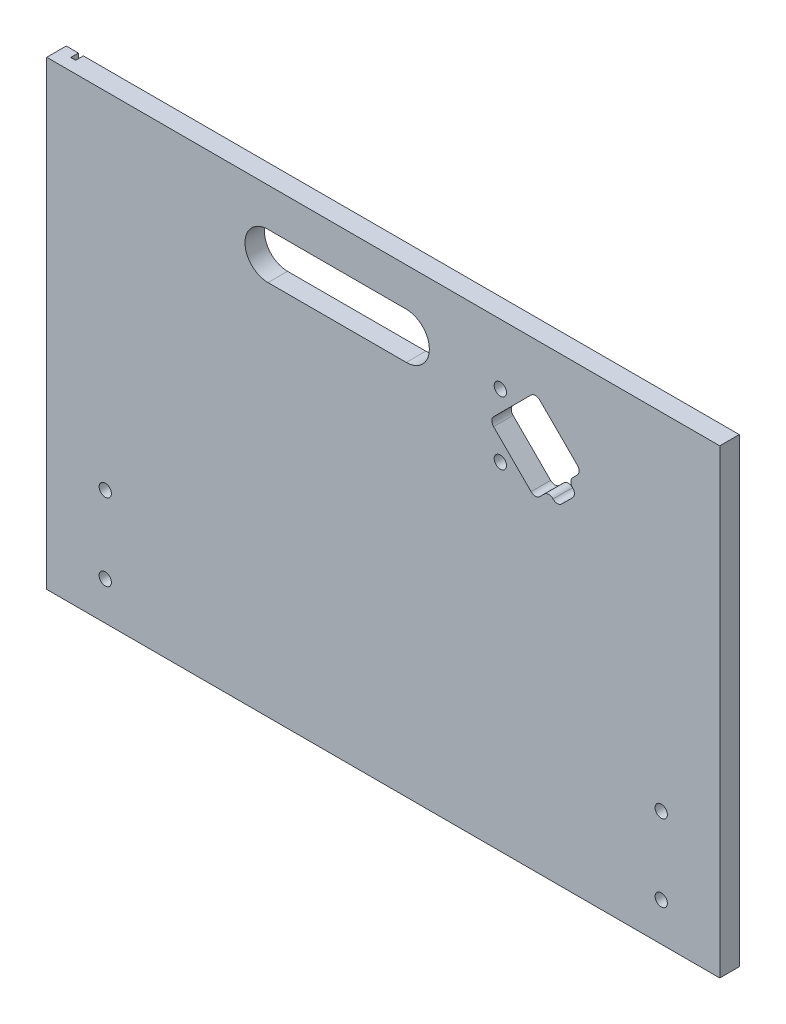
ISO-10303-21;
HEADER;
FILE_DESCRIPTION(('STEP AP214'),'2;1');
FILE_NAME('part.step','',(''),(''),'','','');
FILE_SCHEMA(('AUTOMOTIVE_DESIGN { 1 0 10303 214 1 1 1 1 }'));
ENDSEC;
DATA;
#1=APPLICATION_CONTEXT('core data for automotive mechanical design processes');
#2=APPLICATION_PROTOCOL_DEFINITION('international standard','automotive_design',2000,#1);
#3=PRODUCT_CONTEXT('',#1,'mechanical');
#4=PRODUCT('Part','Part','',(#3));
#5=PRODUCT_RELATED_PRODUCT_CATEGORY('part','',(#4));
#6=PRODUCT_DEFINITION_FORMATION('','',#4);
#7=PRODUCT_DEFINITION_CONTEXT('part definition',#1,'design');
#8=PRODUCT_DEFINITION('design','',#6,#7);
#9=PRODUCT_DEFINITION_SHAPE('','',#8);
#10=(LENGTH_UNIT() NAMED_UNIT(*) SI_UNIT(.MILLI.,.METRE.));
#11=(NAMED_UNIT(*) PLANE_ANGLE_UNIT() SI_UNIT($,.RADIAN.));
#12=(NAMED_UNIT(*) SI_UNIT($,.STERADIAN.) SOLID_ANGLE_UNIT());
#13=UNCERTAINTY_MEASURE_WITH_UNIT(LENGTH_MEASURE(1.E-05),#10,'distance_accuracy_value','');
#14=(GEOMETRIC_REPRESENTATION_CONTEXT(3) GLOBAL_UNCERTAINTY_ASSIGNED_CONTEXT((#13)) GLOBAL_UNIT_ASSIGNED_CONTEXT((#10,
#11,#12)) REPRESENTATION_CONTEXT('',''));
#15=CARTESIAN_POINT('',(0.,0.,0.));
#16=DIRECTION('',(0.,0.,1.));
#17=DIRECTION('',(1.,0.,0.));
#18=AXIS2_PLACEMENT_3D('',#15,#16,#17);
#19=CARTESIAN_POINT('',(0.,0.,12.7));
#20=DIRECTION('',(0.,0.,1.));
#21=DIRECTION('',(1.,0.,0.));
#22=AXIS2_PLACEMENT_3D('',#19,#20,#21);
#23=PLANE('',#22);
#24=CARTESIAN_POINT('',(15.,110.,12.7));
#25=DIRECTION('',(0.,0.,1.));
#26=DIRECTION('',(1.,0.,0.));
#27=AXIS2_PLACEMENT_3D('',#24,#25,#26);
#28=CIRCLE('',#27,15.);
#29=CARTESIAN_POINT('',(15.,95.,12.7));
#30=VERTEX_POINT('',#29);
#31=CARTESIAN_POINT('',(15.,125.,12.7));
#32=VERTEX_POINT('',#31);
#33=EDGE_CURVE('E105',#30,#32,#28,.T.);
#34=ORIENTED_EDGE('',*,*,#33,.F.);
#35=DIRECTION('',(1.,0.,0.));
#36=VECTOR('',#35,1.);
#37=CARTESIAN_POINT('',(15.,95.,12.7));
#38=LINE('',#37,#36);
#39=CARTESIAN_POINT('',(-75.,95.,12.7));
#40=VERTEX_POINT('',#39);
#41=EDGE_CURVE('E270',#40,#30,#38,.T.);
#42=ORIENTED_EDGE('',*,*,#41,.F.);
#43=CARTESIAN_POINT('',(-75.,110.,12.7));
#44=DIRECTION('',(0.,0.,1.));
#45=DIRECTION('',(1.,0.,0.));
#46=AXIS2_PLACEMENT_3D('',#43,#44,#45);
#47=CIRCLE('',#46,15.);
#48=CARTESIAN_POINT('',(-75.,125.,12.7));
#49=VERTEX_POINT('',#48);
#50=EDGE_CURVE('E290',#49,#40,#47,.T.);
#51=ORIENTED_EDGE('',*,*,#50,.F.);
#52=DIRECTION('',(-1.,0.,0.));
#53=VECTOR('',#52,1.);
#54=CARTESIAN_POINT('',(15.,125.,12.7));
#55=LINE('',#54,#53);
#56=EDGE_CURVE('E284',#32,#49,#55,.T.);
#57=ORIENTED_EDGE('',*,*,#56,.F.);
#58=EDGE_LOOP('',(#34,#42,#51,#57));
#59=FACE_BOUND('',#58,.T.);
#60=CARTESIAN_POINT('',(-180.95,-75.,12.7));
#61=DIRECTION('',(0.,0.,1.));
#62=DIRECTION('',(1.,0.,0.));
#63=AXIS2_PLACEMENT_3D('',#60,#61,#62);
#64=CIRCLE('',#63,3.99999999999999);
#65=CARTESIAN_POINT('',(-176.95,-75.,12.7));
#66=VERTEX_POINT('',#65);
#67=EDGE_CURVE('E276',#66,#66,#64,.F.);
#68=ORIENTED_EDGE('',*,*,#67,.T.);
#69=EDGE_LOOP('',(#68));
#70=FACE_BOUND('',#69,.T.);
#71=CARTESIAN_POINT('',(-180.95,-125.,12.7));
#72=DIRECTION('',(0.,0.,1.));
#73=DIRECTION('',(1.,0.,0.));
#74=AXIS2_PLACEMENT_3D('',#71,#72,#73);
#75=CIRCLE('',#74,4.);
#76=CARTESIAN_POINT('',(-176.95,-125.,12.7));
#77=VERTEX_POINT('',#76);
#78=EDGE_CURVE('E302',#77,#77,#75,.F.);
#79=ORIENTED_EDGE('',*,*,#78,.T.);
#80=EDGE_LOOP('',(#79));
#81=FACE_BOUND('',#80,.T.);
#82=CARTESIAN_POINT('',(180.95,-125.,12.7));
#83=DIRECTION('',(0.,0.,1.));
#84=DIRECTION('',(1.,0.,0.));
#85=AXIS2_PLACEMENT_3D('',#82,#83,#84);
#86=CIRCLE('',#85,4.);
#87=CARTESIAN_POINT('',(184.95,-125.,12.7));
#88=VERTEX_POINT('',#87);
#89=EDGE_CURVE('E308',#88,#88,#86,.F.);
#90=ORIENTED_EDGE('',*,*,#89,.T.);
#91=EDGE_LOOP('',(#90));
#92=FACE_BOUND('',#91,.T.);
#93=CARTESIAN_POINT('',(180.95,-75.,12.7));
#94=DIRECTION('',(0.,0.,1.));
#95=DIRECTION('',(1.,0.,0.));
#96=AXIS2_PLACEMENT_3D('',#93,#94,#95);
#97=CIRCLE('',#96,3.99999999999999);
#98=CARTESIAN_POINT('',(184.95,-75.,12.7));
#99=VERTEX_POINT('',#98);
#100=EDGE_CURVE('E314',#99,#99,#97,.F.);
#101=ORIENTED_EDGE('',*,*,#100,.T.);
#102=EDGE_LOOP('',(#101));
#103=FACE_BOUND('',#102,.T.);
#104=DIRECTION('',(0.,-1.,0.));
#105=VECTOR('',#104,1.);
#106=CARTESIAN_POINT('',(219.05,0.,12.7));
#107=LINE('',#106,#105);
#108=CARTESIAN_POINT('',(219.05,150.,12.7));
#109=VERTEX_POINT('',#108);
#110=CARTESIAN_POINT('',(219.05,-150.,12.7));
#111=VERTEX_POINT('',#110);
#112=EDGE_CURVE('E400',#109,#111,#107,.T.);
#113=ORIENTED_EDGE('',*,*,#112,.F.);
#114=DIRECTION('',(-1.,0.,0.));
#115=VECTOR('',#114,1.);
#116=CARTESIAN_POINT('',(0.,150.,12.7));
#117=LINE('',#116,#115);
#118=CARTESIAN_POINT('',(-219.05,150.,12.7));
#119=VERTEX_POINT('',#118);
#120=EDGE_CURVE('E403',#109,#119,#117,.T.);
#121=ORIENTED_EDGE('',*,*,#120,.T.);
#122=DIRECTION('',(0.,-1.,0.));
#123=VECTOR('',#122,1.);
#124=CARTESIAN_POINT('',(-219.05,0.,12.7));
#125=LINE('',#124,#123);
#126=CARTESIAN_POINT('',(-219.05,-150.,12.7));
#127=VERTEX_POINT('',#126);
#128=EDGE_CURVE('E406',#119,#127,#125,.T.);
#129=ORIENTED_EDGE('',*,*,#128,.T.);
#130=DIRECTION('',(-1.,0.,0.));
#131=VECTOR('',#130,1.);
#132=CARTESIAN_POINT('',(0.,-150.,12.7));
#133=LINE('',#132,#131);
#134=EDGE_CURVE('E408',#111,#127,#133,.T.);
#135=ORIENTED_EDGE('',*,*,#134,.F.);
#136=EDGE_LOOP('',(#113,#121,#129,#135));
#137=FACE_BOUND('',#136,.T.);
#138=DIRECTION('',(-0.707106781186544,-0.707106781186551,0.));
#139=VECTOR('',#138,1.);
#140=CARTESIAN_POINT('',(19.5510191002148,-19.5510191002146,12.7));
#141=LINE('',#140,#139);
#142=CARTESIAN_POINT('',(126.273611075682,87.1715728752538,12.7));
#143=VERTEX_POINT('',#142);
#144=CARTESIAN_POINT('',(123.268407255639,84.1663690552109,12.7));
#145=VERTEX_POINT('',#144);
#146=EDGE_CURVE('E387',#143,#145,#141,.T.);
#147=ORIENTED_EDGE('',*,*,#146,.T.);
#148=CARTESIAN_POINT('',(126.096834380386,81.3379419304648,12.7));
#149=DIRECTION('',(0.,0.,1.));
#150=DIRECTION('',(1.,0.,0.));
#151=AXIS2_PLACEMENT_3D('',#148,#149,#150);
#152=CIRCLE('',#151,4.);
#153=CARTESIAN_POINT('',(123.268407255639,78.5095148057186,12.7));
#154=VERTEX_POINT('',#153);
#155=EDGE_CURVE('E453',#145,#154,#152,.T.);
#156=ORIENTED_EDGE('',*,*,#155,.T.);
#157=CARTESIAN_POINT('',(120.439980130893,75.6810876809724,12.7));
#158=DIRECTION('',(0.,0.,1.));
#159=DIRECTION('',(1.,0.,0.));
#160=AXIS2_PLACEMENT_3D('',#157,#158,#159);
#161=CIRCLE('',#160,4.);
#162=CARTESIAN_POINT('',(123.268407255639,72.8526605562262,12.7));
#163=VERTEX_POINT('',#162);
#164=EDGE_CURVE('E481',#154,#163,#161,.F.);
#165=ORIENTED_EDGE('',*,*,#164,.T.);
#166=DIRECTION('',(-0.707106781186545,-0.70710678118655,0.));
#167=VECTOR('',#166,1.);
#168=CARTESIAN_POINT('',(25.2078733497071,-25.2078733497069,12.7));
#169=LINE('',#168,#167);
#170=CARTESIAN_POINT('',(116.197339443774,65.7815927443607,12.7));
#171=VERTEX_POINT('',#170);
#172=EDGE_CURVE('E384',#163,#171,#169,.T.);
#173=ORIENTED_EDGE('',*,*,#172,.T.);
#174=CARTESIAN_POINT('',(113.368912319028,68.6100198691068,12.7));
#175=DIRECTION('',(0.,0.,1.));
#176=DIRECTION('',(1.,0.,0.));
#177=AXIS2_PLACEMENT_3D('',#174,#175,#176);
#178=CIRCLE('',#177,4.);
#179=CARTESIAN_POINT('',(110.540485194282,65.7815927443606,12.7));
#180=VERTEX_POINT('',#179);
#181=EDGE_CURVE('E485',#171,#180,#178,.F.);
#182=ORIENTED_EDGE('',*,*,#181,.T.);
#183=CARTESIAN_POINT('',(107.712058069535,62.9531656196144,12.7));
#184=DIRECTION('',(0.,0.,1.));
#185=DIRECTION('',(1.,0.,0.));
#186=AXIS2_PLACEMENT_3D('',#183,#184,#185);
#187=CIRCLE('',#186,4.);
#188=CARTESIAN_POINT('',(104.883630944789,65.7815927443607,12.7));
#189=VERTEX_POINT('',#188);
#190=EDGE_CURVE('E451',#180,#189,#187,.T.);
#191=ORIENTED_EDGE('',*,*,#190,.T.);
#192=DIRECTION('',(0.707106781186545,0.70710678118655,0.));
#193=VECTOR('',#192,1.);
#194=CARTESIAN_POINT('',(19.5510191002147,-19.5510191002145,12.7));
#195=LINE('',#194,#193);
#196=CARTESIAN_POINT('',(101.878427124746,62.7763889243178,12.7));
#197=VERTEX_POINT('',#196);
#198=EDGE_CURVE('E381',#197,#189,#195,.T.);
#199=ORIENTED_EDGE('',*,*,#198,.F.);
#200=CARTESIAN_POINT('',(99.0500000000002,65.604816049064,12.7));
#201=DIRECTION('',(0.,0.,1.));
#202=DIRECTION('',(1.,0.,0.));
#203=AXIS2_PLACEMENT_3D('',#200,#201,#202);
#204=CIRCLE('',#203,4.);
#205=CARTESIAN_POINT('',(96.221572875254,62.7763889243178,12.7));
#206=VERTEX_POINT('',#205);
#207=EDGE_CURVE('E97',#197,#206,#204,.F.);
#208=ORIENTED_EDGE('',*,*,#207,.T.);
#209=DIRECTION('',(0.70710678118655,-0.707106781186546,0.));
#210=VECTOR('',#209,1.);
#211=CARTESIAN_POINT('',(79.4989808997856,79.4989808997861,12.7));
#212=LINE('',#211,#210);
#213=CARTESIAN_POINT('',(71.8263889243181,87.1715728752536,12.7));
#214=VERTEX_POINT('',#213);
#215=EDGE_CURVE('E378',#214,#206,#212,.T.);
#216=ORIENTED_EDGE('',*,*,#215,.F.);
#217=CARTESIAN_POINT('',(74.6548160490642,89.9999999999998,12.7));
#218=DIRECTION('',(0.,0.,1.));
#219=DIRECTION('',(1.,0.,0.));
#220=AXIS2_PLACEMENT_3D('',#217,#218,#219);
#221=CIRCLE('',#220,4.);
#222=CARTESIAN_POINT('',(71.826388924318,92.828427124746,12.7));
#223=VERTEX_POINT('',#222);
#224=EDGE_CURVE('E477',#214,#223,#221,.F.);
#225=ORIENTED_EDGE('',*,*,#224,.T.);
#226=DIRECTION('',(-0.707106781186545,-0.70710678118655,0.));
#227=VECTOR('',#226,1.);
#228=CARTESIAN_POINT('',(-10.5010191002137,10.5010191002136,12.7));
#229=LINE('',#228,#227);
#230=CARTESIAN_POINT('',(96.2215728752538,117.223611075682,12.7));
#231=VERTEX_POINT('',#230);
#232=EDGE_CURVE('E393',#231,#223,#229,.T.);
#233=ORIENTED_EDGE('',*,*,#232,.F.);
#234=CARTESIAN_POINT('',(99.05,114.395183950936,12.7));
#235=DIRECTION('',(0.,0.,1.));
#236=DIRECTION('',(1.,0.,0.));
#237=AXIS2_PLACEMENT_3D('',#234,#235,#236);
#238=CIRCLE('',#237,4.);
#239=CARTESIAN_POINT('',(101.878427124746,117.223611075682,12.7));
#240=VERTEX_POINT('',#239);
#241=EDGE_CURVE('E473',#231,#240,#238,.F.);
#242=ORIENTED_EDGE('',*,*,#241,.T.);
#243=DIRECTION('',(0.70710678118655,-0.707106781186545,0.));
#244=VECTOR('',#243,1.);
#245=CARTESIAN_POINT('',(109.551019100214,109.551019100215,12.7));
#246=LINE('',#245,#244);
#247=CARTESIAN_POINT('',(126.273611075682,92.8284271247462,12.7));
#248=VERTEX_POINT('',#247);
#249=EDGE_CURVE('E390',#240,#248,#246,.T.);
#250=ORIENTED_EDGE('',*,*,#249,.T.);
#251=CARTESIAN_POINT('',(123.445183950936,90.,12.7));
#252=DIRECTION('',(0.,0.,1.));
#253=DIRECTION('',(1.,0.,0.));
#254=AXIS2_PLACEMENT_3D('',#251,#252,#253);
#255=CIRCLE('',#254,4.);
#256=EDGE_CURVE('E469',#248,#143,#255,.F.);
#257=ORIENTED_EDGE('',*,*,#256,.T.);
#258=EDGE_LOOP('',(#147,#156,#165,#173,#182,#191,#199,#208,#216,#225,#233,#242,#250,#257));
#259=FACE_BOUND('',#258,.T.);
#260=CARTESIAN_POINT('',(76.2148703851,110.5900655849,12.7));
#261=DIRECTION('',(0.,0.,1.));
#262=DIRECTION('',(1.,0.,0.));
#263=AXIS2_PLACEMENT_3D('',#260,#261,#262);
#264=CIRCLE('',#263,4.0000000001913);
#265=CARTESIAN_POINT('',(80.2148703852913,110.5900655849,12.7));
#266=VERTEX_POINT('',#265);
#267=EDGE_CURVE('E353',#266,#266,#264,.T.);
#268=ORIENTED_EDGE('',*,*,#267,.F.);
#269=EDGE_LOOP('',(#268));
#270=FACE_BOUND('',#269,.T.);
#271=CARTESIAN_POINT('',(76.2148703851002,69.4099344154998,12.7));
#272=DIRECTION('',(0.,0.,1.));
#273=DIRECTION('',(1.,0.,0.));
#274=AXIS2_PLACEMENT_3D('',#271,#272,#273);
#275=CIRCLE('',#274,4.00000000019125);
#276=CARTESIAN_POINT('',(80.2148703852914,69.4099344154998,12.7));
#277=VERTEX_POINT('',#276);
#278=EDGE_CURVE('E350',#277,#277,#275,.F.);
#279=ORIENTED_EDGE('',*,*,#278,.T.);
#280=EDGE_LOOP('',(#279));
#281=FACE_BOUND('',#280,.T.);
#282=ADVANCED_FACE('F88',(#59,#70,#81,#92,#103,#137,#259,#270,#281),#23,.T.);
#283=CARTESIAN_POINT('',(0.,0.,0.));
#284=DIRECTION('',(0.,0.,1.));
#285=DIRECTION('',(1.,0.,0.));
#286=AXIS2_PLACEMENT_3D('',#283,#284,#285);
#287=PLANE('',#286);
#288=DIRECTION('',(-1.,0.,0.));
#289=VECTOR('',#288,1.);
#290=CARTESIAN_POINT('',(15.,95.,0.));
#291=LINE('',#290,#289);
#292=CARTESIAN_POINT('',(15.,95.,0.));
#293=VERTEX_POINT('',#292);
#294=CARTESIAN_POINT('',(-75.,95.,0.));
#295=VERTEX_POINT('',#294);
#296=EDGE_CURVE('E282',#293,#295,#291,.T.);
#297=ORIENTED_EDGE('',*,*,#296,.F.);
#298=CARTESIAN_POINT('',(15.,110.,0.));
#299=DIRECTION('',(0.,0.,1.));
#300=DIRECTION('',(1.,0.,0.));
#301=AXIS2_PLACEMENT_3D('',#298,#299,#300);
#302=CIRCLE('',#301,15.);
#303=CARTESIAN_POINT('',(15.,125.,0.));
#304=VERTEX_POINT('',#303);
#305=EDGE_CURVE('E264',#304,#293,#302,.F.);
#306=ORIENTED_EDGE('',*,*,#305,.F.);
#307=DIRECTION('',(1.,0.,0.));
#308=VECTOR('',#307,1.);
#309=CARTESIAN_POINT('',(15.,125.,0.));
#310=LINE('',#309,#308);
#311=CARTESIAN_POINT('',(-75.,125.,0.));
#312=VERTEX_POINT('',#311);
#313=EDGE_CURVE('E273',#312,#304,#310,.T.);
#314=ORIENTED_EDGE('',*,*,#313,.F.);
#315=CARTESIAN_POINT('',(-75.,110.,0.));
#316=DIRECTION('',(0.,0.,1.));
#317=DIRECTION('',(1.,0.,0.));
#318=AXIS2_PLACEMENT_3D('',#315,#316,#317);
#319=CIRCLE('',#318,15.);
#320=EDGE_CURVE('E113',#295,#312,#319,.F.);
#321=ORIENTED_EDGE('',*,*,#320,.F.);
#322=EDGE_LOOP('',(#297,#306,#314,#321));
#323=FACE_BOUND('',#322,.T.);
#324=CARTESIAN_POINT('',(-180.95,-75.,0.));
#325=DIRECTION('',(0.,0.,-1.));
#326=DIRECTION('',(1.,0.,0.));
#327=AXIS2_PLACEMENT_3D('',#324,#325,#326);
#328=CIRCLE('',#327,3.99999999999999);
#329=CARTESIAN_POINT('',(-176.95,-75.,0.));
#330=VERTEX_POINT('',#329);
#331=EDGE_CURVE('E299',#330,#330,#328,.T.);
#332=ORIENTED_EDGE('',*,*,#331,.F.);
#333=EDGE_LOOP('',(#332));
#334=FACE_BOUND('',#333,.T.);
#335=CARTESIAN_POINT('',(-180.95,-125.,0.));
#336=DIRECTION('',(0.,0.,-1.));
#337=DIRECTION('',(-1.,0.,0.));
#338=AXIS2_PLACEMENT_3D('',#335,#336,#337);
#339=CIRCLE('',#338,4.);
#340=CARTESIAN_POINT('',(-184.95,-125.,0.));
#341=VERTEX_POINT('',#340);
#342=EDGE_CURVE('E305',#341,#341,#339,.T.);
#343=ORIENTED_EDGE('',*,*,#342,.F.);
#344=EDGE_LOOP('',(#343));
#345=FACE_BOUND('',#344,.T.);
#346=CARTESIAN_POINT('',(180.95,-125.,0.));
#347=DIRECTION('',(0.,0.,-1.));
#348=DIRECTION('',(1.,0.,0.));
#349=AXIS2_PLACEMENT_3D('',#346,#347,#348);
#350=CIRCLE('',#349,4.);
#351=CARTESIAN_POINT('',(184.95,-125.,0.));
#352=VERTEX_POINT('',#351);
#353=EDGE_CURVE('E311',#352,#352,#350,.T.);
#354=ORIENTED_EDGE('',*,*,#353,.F.);
#355=EDGE_LOOP('',(#354));
#356=FACE_BOUND('',#355,.T.);
#357=CARTESIAN_POINT('',(180.95,-75.,0.));
#358=DIRECTION('',(0.,0.,-1.));
#359=DIRECTION('',(-1.,0.,0.));
#360=AXIS2_PLACEMENT_3D('',#357,#358,#359);
#361=CIRCLE('',#360,3.99999999999999);
#362=CARTESIAN_POINT('',(176.95,-75.,0.));
#363=VERTEX_POINT('',#362);
#364=EDGE_CURVE('E317',#363,#363,#361,.T.);
#365=ORIENTED_EDGE('',*,*,#364,.F.);
#366=EDGE_LOOP('',(#365));
#367=FACE_BOUND('',#366,.T.);
#368=DIRECTION('',(-1.,0.,0.));
#369=VECTOR('',#368,1.);
#370=CARTESIAN_POINT('',(-207.9375,-55.,0.));
#371=LINE('',#370,#369);
#372=CARTESIAN_POINT('',(-207.9375,-55.,0.));
#373=VERTEX_POINT('',#372);
#374=CARTESIAN_POINT('',(-211.1125,-55.,0.));
#375=VERTEX_POINT('',#374);
#376=EDGE_CURVE('E338',#373,#375,#371,.T.);
#377=ORIENTED_EDGE('',*,*,#376,.F.);
#378=DIRECTION('',(0.,-1.,0.));
#379=VECTOR('',#378,1.);
#380=CARTESIAN_POINT('',(-207.9375,150.,0.));
#381=LINE('',#380,#379);
#382=CARTESIAN_POINT('',(-207.9375,150.,0.));
#383=VERTEX_POINT('',#382);
#384=EDGE_CURVE('E320',#383,#373,#381,.T.);
#385=ORIENTED_EDGE('',*,*,#384,.F.);
#386=DIRECTION('',(-1.,0.,0.));
#387=VECTOR('',#386,1.);
#388=CARTESIAN_POINT('',(0.,150.,0.));
#389=LINE('',#388,#387);
#390=CARTESIAN_POINT('',(219.05,150.,0.));
#391=VERTEX_POINT('',#390);
#392=EDGE_CURVE('E415',#391,#383,#389,.T.);
#393=ORIENTED_EDGE('',*,*,#392,.F.);
#394=DIRECTION('',(0.,-1.,0.));
#395=VECTOR('',#394,1.);
#396=CARTESIAN_POINT('',(219.05,0.,0.));
#397=LINE('',#396,#395);
#398=CARTESIAN_POINT('',(219.05,-150.,0.));
#399=VERTEX_POINT('',#398);
#400=EDGE_CURVE('E399',#391,#399,#397,.T.);
#401=ORIENTED_EDGE('',*,*,#400,.T.);
#402=DIRECTION('',(-1.,0.,0.));
#403=VECTOR('',#402,1.);
#404=CARTESIAN_POINT('',(0.,-150.,0.));
#405=LINE('',#404,#403);
#406=CARTESIAN_POINT('',(-219.05,-150.,0.));
#407=VERTEX_POINT('',#406);
#408=EDGE_CURVE('E404',#399,#407,#405,.T.);
#409=ORIENTED_EDGE('',*,*,#408,.T.);
#410=DIRECTION('',(0.,-1.,0.));
#411=VECTOR('',#410,1.);
#412=CARTESIAN_POINT('',(-219.05,0.,0.));
#413=LINE('',#412,#411);
#414=CARTESIAN_POINT('',(-219.05,150.,0.));
#415=VERTEX_POINT('',#414);
#416=EDGE_CURVE('E418',#415,#407,#413,.T.);
#417=ORIENTED_EDGE('',*,*,#416,.F.);
#418=CARTESIAN_POINT('',(-211.1125,150.,0.));
#419=VERTEX_POINT('',#418);
#420=EDGE_CURVE('E414',#419,#415,#389,.T.);
#421=ORIENTED_EDGE('',*,*,#420,.F.);
#422=DIRECTION('',(0.,1.,0.));
#423=VECTOR('',#422,1.);
#424=CARTESIAN_POINT('',(-211.1125,150.,0.));
#425=LINE('',#424,#423);
#426=EDGE_CURVE('E327',#375,#419,#425,.T.);
#427=ORIENTED_EDGE('',*,*,#426,.F.);
#428=EDGE_LOOP('',(#377,#385,#393,#401,#409,#417,#421,#427));
#429=FACE_BOUND('',#428,.T.);
#430=DIRECTION('',(0.707106781186545,0.70710678118655,0.));
#431=VECTOR('',#430,1.);
#432=CARTESIAN_POINT('',(25.2078733497071,-25.2078733497069,0.));
#433=LINE('',#432,#431);
#434=CARTESIAN_POINT('',(116.197339443774,65.7815927443607,0.));
#435=VERTEX_POINT('',#434);
#436=CARTESIAN_POINT('',(123.268407255639,72.8526605562262,0.));
#437=VERTEX_POINT('',#436);
#438=EDGE_CURVE('E363',#435,#437,#433,.T.);
#439=ORIENTED_EDGE('',*,*,#438,.T.);
#440=CARTESIAN_POINT('',(120.439980130893,75.6810876809724,0.));
#441=DIRECTION('',(0.,0.,1.));
#442=DIRECTION('',(1.,0.,0.));
#443=AXIS2_PLACEMENT_3D('',#440,#441,#442);
#444=CIRCLE('',#443,4.);
#445=CARTESIAN_POINT('',(123.268407255639,78.5095148057186,0.));
#446=VERTEX_POINT('',#445);
#447=EDGE_CURVE('E483',#437,#446,#444,.T.);
#448=ORIENTED_EDGE('',*,*,#447,.T.);
#449=CARTESIAN_POINT('',(126.096834380386,81.3379419304648,0.));
#450=DIRECTION('',(0.,0.,1.));
#451=DIRECTION('',(1.,0.,0.));
#452=AXIS2_PLACEMENT_3D('',#449,#450,#451);
#453=CIRCLE('',#452,4.);
#454=CARTESIAN_POINT('',(123.268407255639,84.1663690552109,0.));
#455=VERTEX_POINT('',#454);
#456=EDGE_CURVE('E457',#446,#455,#453,.F.);
#457=ORIENTED_EDGE('',*,*,#456,.T.);
#458=DIRECTION('',(0.707106781186544,0.707106781186551,0.));
#459=VECTOR('',#458,1.);
#460=CARTESIAN_POINT('',(19.5510191002148,-19.5510191002146,0.));
#461=LINE('',#460,#459);
#462=CARTESIAN_POINT('',(126.273611075682,87.1715728752538,0.));
#463=VERTEX_POINT('',#462);
#464=EDGE_CURVE('E366',#455,#463,#461,.T.);
#465=ORIENTED_EDGE('',*,*,#464,.T.);
#466=CARTESIAN_POINT('',(123.445183950936,90.,0.));
#467=DIRECTION('',(0.,0.,1.));
#468=DIRECTION('',(1.,0.,0.));
#469=AXIS2_PLACEMENT_3D('',#466,#467,#468);
#470=CIRCLE('',#469,4.);
#471=CARTESIAN_POINT('',(126.273611075682,92.8284271247462,0.));
#472=VERTEX_POINT('',#471);
#473=EDGE_CURVE('E471',#463,#472,#470,.T.);
#474=ORIENTED_EDGE('',*,*,#473,.T.);
#475=DIRECTION('',(-0.70710678118655,0.707106781186545,0.));
#476=VECTOR('',#475,1.);
#477=CARTESIAN_POINT('',(109.551019100214,109.551019100215,0.));
#478=LINE('',#477,#476);
#479=CARTESIAN_POINT('',(101.878427124746,117.223611075682,0.));
#480=VERTEX_POINT('',#479);
#481=EDGE_CURVE('E369',#472,#480,#478,.T.);
#482=ORIENTED_EDGE('',*,*,#481,.T.);
#483=CARTESIAN_POINT('',(99.05,114.395183950936,0.));
#484=DIRECTION('',(0.,0.,1.));
#485=DIRECTION('',(1.,0.,0.));
#486=AXIS2_PLACEMENT_3D('',#483,#484,#485);
#487=CIRCLE('',#486,4.);
#488=CARTESIAN_POINT('',(96.2215728752538,117.223611075682,0.));
#489=VERTEX_POINT('',#488);
#490=EDGE_CURVE('E475',#480,#489,#487,.T.);
#491=ORIENTED_EDGE('',*,*,#490,.T.);
#492=DIRECTION('',(0.707106781186545,0.70710678118655,0.));
#493=VECTOR('',#492,1.);
#494=CARTESIAN_POINT('',(-10.5010191002137,10.5010191002136,0.));
#495=LINE('',#494,#493);
#496=CARTESIAN_POINT('',(71.826388924318,92.828427124746,0.));
#497=VERTEX_POINT('',#496);
#498=EDGE_CURVE('E372',#497,#489,#495,.T.);
#499=ORIENTED_EDGE('',*,*,#498,.F.);
#500=CARTESIAN_POINT('',(74.6548160490642,89.9999999999998,0.));
#501=DIRECTION('',(0.,0.,1.));
#502=DIRECTION('',(1.,0.,0.));
#503=AXIS2_PLACEMENT_3D('',#500,#501,#502);
#504=CIRCLE('',#503,4.);
#505=CARTESIAN_POINT('',(71.8263889243181,87.1715728752536,0.));
#506=VERTEX_POINT('',#505);
#507=EDGE_CURVE('E479',#497,#506,#504,.T.);
#508=ORIENTED_EDGE('',*,*,#507,.T.);
#509=DIRECTION('',(-0.70710678118655,0.707106781186546,0.));
#510=VECTOR('',#509,1.);
#511=CARTESIAN_POINT('',(79.4989808997856,79.4989808997861,0.));
#512=LINE('',#511,#510);
#513=CARTESIAN_POINT('',(96.221572875254,62.7763889243178,0.));
#514=VERTEX_POINT('',#513);
#515=EDGE_CURVE('E375',#514,#506,#512,.T.);
#516=ORIENTED_EDGE('',*,*,#515,.F.);
#517=CARTESIAN_POINT('',(99.0500000000002,65.604816049064,0.));
#518=DIRECTION('',(0.,0.,1.));
#519=DIRECTION('',(1.,0.,0.));
#520=AXIS2_PLACEMENT_3D('',#517,#518,#519);
#521=CIRCLE('',#520,4.);
#522=CARTESIAN_POINT('',(101.878427124746,62.7763889243178,0.));
#523=VERTEX_POINT('',#522);
#524=EDGE_CURVE('E12',#514,#523,#521,.T.);
#525=ORIENTED_EDGE('',*,*,#524,.T.);
#526=DIRECTION('',(-0.707106781186545,-0.70710678118655,0.));
#527=VECTOR('',#526,1.);
#528=CARTESIAN_POINT('',(19.5510191002147,-19.5510191002145,0.));
#529=LINE('',#528,#527);
#530=CARTESIAN_POINT('',(104.883630944789,65.7815927443607,0.));
#531=VERTEX_POINT('',#530);
#532=EDGE_CURVE('E396',#531,#523,#529,.T.);
#533=ORIENTED_EDGE('',*,*,#532,.F.);
#534=CARTESIAN_POINT('',(107.712058069535,62.9531656196144,0.));
#535=DIRECTION('',(0.,0.,1.));
#536=DIRECTION('',(1.,0.,0.));
#537=AXIS2_PLACEMENT_3D('',#534,#535,#536);
#538=CIRCLE('',#537,4.);
#539=CARTESIAN_POINT('',(110.540485194282,65.7815927443606,0.));
#540=VERTEX_POINT('',#539);
#541=EDGE_CURVE('E455',#531,#540,#538,.F.);
#542=ORIENTED_EDGE('',*,*,#541,.T.);
#543=CARTESIAN_POINT('',(113.368912319028,68.6100198691068,0.));
#544=DIRECTION('',(0.,0.,1.));
#545=DIRECTION('',(1.,0.,0.));
#546=AXIS2_PLACEMENT_3D('',#543,#544,#545);
#547=CIRCLE('',#546,4.);
#548=EDGE_CURVE('E487',#540,#435,#547,.T.);
#549=ORIENTED_EDGE('',*,*,#548,.T.);
#550=EDGE_LOOP('',(#439,#448,#457,#465,#474,#482,#491,#499,#508,#516,#525,#533,#542,#549));
#551=FACE_BOUND('',#550,.T.);
#552=CARTESIAN_POINT('',(76.2148703851,110.5900655849,0.));
#553=DIRECTION('',(0.,0.,1.));
#554=DIRECTION('',(1.,0.,0.));
#555=AXIS2_PLACEMENT_3D('',#552,#553,#554);
#556=CIRCLE('',#555,4.0000000001913);
#557=CARTESIAN_POINT('',(80.2148703852913,110.5900655849,0.));
#558=VERTEX_POINT('',#557);
#559=EDGE_CURVE('E360',#558,#558,#556,.F.);
#560=ORIENTED_EDGE('',*,*,#559,.F.);
#561=EDGE_LOOP('',(#560));
#562=FACE_BOUND('',#561,.T.);
#563=CARTESIAN_POINT('',(76.2148703851002,69.4099344154998,0.));
#564=DIRECTION('',(0.,0.,1.));
#565=DIRECTION('',(1.,0.,0.));
#566=AXIS2_PLACEMENT_3D('',#563,#564,#565);
#567=CIRCLE('',#566,4.00000000019125);
#568=CARTESIAN_POINT('',(80.2148703852914,69.4099344154998,0.));
#569=VERTEX_POINT('',#568);
#570=EDGE_CURVE('E354',#569,#569,#567,.T.);
#571=ORIENTED_EDGE('',*,*,#570,.T.);
#572=EDGE_LOOP('',(#571));
#573=FACE_BOUND('',#572,.T.);
#574=ADVANCED_FACE('F279',(#323,#334,#345,#356,#367,#429,#551,#562,#573),#287,.F.);
#575=CARTESIAN_POINT('',(219.05,0.,12.7));
#576=DIRECTION('',(1.,0.,0.));
#577=DIRECTION('',(0.,0.,-1.));
#578=AXIS2_PLACEMENT_3D('',#575,#576,#577);
#579=PLANE('',#578);
#580=ORIENTED_EDGE('',*,*,#400,.F.);
#581=DIRECTION('',(0.,0.,-1.));
#582=VECTOR('',#581,1.);
#583=CARTESIAN_POINT('',(219.05,150.,12.7));
#584=LINE('',#583,#582);
#585=EDGE_CURVE('E429',#109,#391,#584,.T.);
#586=ORIENTED_EDGE('',*,*,#585,.F.);
#587=ORIENTED_EDGE('',*,*,#112,.T.);
#588=DIRECTION('',(0.,0.,-1.));
#589=VECTOR('',#588,1.);
#590=CARTESIAN_POINT('',(219.05,-150.,12.7));
#591=LINE('',#590,#589);
#592=EDGE_CURVE('E411',#111,#399,#591,.T.);
#593=ORIENTED_EDGE('',*,*,#592,.T.);
#594=EDGE_LOOP('',(#580,#586,#587,#593));
#595=FACE_BOUND('',#594,.T.);
#596=ADVANCED_FACE('F559',(#595),#579,.T.);
#597=CARTESIAN_POINT('',(0.,150.,12.7));
#598=DIRECTION('',(0.,-1.,0.));
#599=DIRECTION('',(1.,0.,0.));
#600=AXIS2_PLACEMENT_3D('',#597,#598,#599);
#601=PLANE('',#600);
#602=ORIENTED_EDGE('',*,*,#392,.T.);
#603=DIRECTION('',(0.,0.,-1.));
#604=VECTOR('',#603,1.);
#605=CARTESIAN_POINT('',(-207.9375,150.,5.));
#606=LINE('',#605,#604);
#607=CARTESIAN_POINT('',(-207.9375,150.,5.));
#608=VERTEX_POINT('',#607);
#609=EDGE_CURVE('E342',#608,#383,#606,.T.);
#610=ORIENTED_EDGE('',*,*,#609,.F.);
#611=DIRECTION('',(1.,0.,0.));
#612=VECTOR('',#611,1.);
#613=CARTESIAN_POINT('',(-207.9375,150.,5.));
#614=LINE('',#613,#612);
#615=CARTESIAN_POINT('',(-211.1125,150.,5.));
#616=VERTEX_POINT('',#615);
#617=EDGE_CURVE('E332',#616,#608,#614,.T.);
#618=ORIENTED_EDGE('',*,*,#617,.F.);
#619=DIRECTION('',(0.,0.,-1.));
#620=VECTOR('',#619,1.);
#621=CARTESIAN_POINT('',(-211.1125,150.,5.));
#622=LINE('',#621,#620);
#623=EDGE_CURVE('E344',#616,#419,#622,.T.);
#624=ORIENTED_EDGE('',*,*,#623,.T.);
#625=ORIENTED_EDGE('',*,*,#420,.T.);
#626=DIRECTION('',(0.,0.,-1.));
#627=VECTOR('',#626,1.);
#628=CARTESIAN_POINT('',(-219.05,150.,12.7));
#629=LINE('',#628,#627);
#630=EDGE_CURVE('E426',#119,#415,#629,.T.);
#631=ORIENTED_EDGE('',*,*,#630,.F.);
#632=ORIENTED_EDGE('',*,*,#120,.F.);
#633=ORIENTED_EDGE('',*,*,#585,.T.);
#634=EDGE_LOOP('',(#602,#610,#618,#624,#625,#631,#632,#633));
#635=FACE_BOUND('',#634,.T.);
#636=ADVANCED_FACE('F595',(#635),#601,.F.);
#637=CARTESIAN_POINT('',(-219.05,0.,12.7));
#638=DIRECTION('',(1.,0.,0.));
#639=DIRECTION('',(0.,1.,0.));
#640=AXIS2_PLACEMENT_3D('',#637,#638,#639);
#641=PLANE('',#640);
#642=ORIENTED_EDGE('',*,*,#416,.T.);
#643=DIRECTION('',(0.,0.,-1.));
#644=VECTOR('',#643,1.);
#645=CARTESIAN_POINT('',(-219.05,-150.,12.7));
#646=LINE('',#645,#644);
#647=EDGE_CURVE('E424',#127,#407,#646,.T.);
#648=ORIENTED_EDGE('',*,*,#647,.F.);
#649=ORIENTED_EDGE('',*,*,#128,.F.);
#650=ORIENTED_EDGE('',*,*,#630,.T.);
#651=EDGE_LOOP('',(#642,#648,#649,#650));
#652=FACE_BOUND('',#651,.T.);
#653=ADVANCED_FACE('F591',(#652),#641,.F.);
#654=CARTESIAN_POINT('',(0.,-150.,12.7));
#655=DIRECTION('',(0.,-1.,0.));
#656=DIRECTION('',(1.,0.,0.));
#657=AXIS2_PLACEMENT_3D('',#654,#655,#656);
#658=PLANE('',#657);
#659=ORIENTED_EDGE('',*,*,#408,.F.);
#660=ORIENTED_EDGE('',*,*,#592,.F.);
#661=ORIENTED_EDGE('',*,*,#134,.T.);
#662=ORIENTED_EDGE('',*,*,#647,.T.);
#663=EDGE_LOOP('',(#659,#660,#661,#662));
#664=FACE_BOUND('',#663,.T.);
#665=ADVANCED_FACE('F588',(#664),#658,.T.);
#666=CARTESIAN_POINT('',(79.4989808997856,79.4989808997861,-0.000999999999999265));
#667=DIRECTION('',(-0.707106781186545,-0.707106781186549,0.));
#668=DIRECTION('',(0.70710678118655,-0.707106781186546,0.));
#669=AXIS2_PLACEMENT_3D('',#666,#667,#668);
#670=PLANE('',#669);
#671=ORIENTED_EDGE('',*,*,#515,.T.);
#672=DIRECTION('',(0.,0.,1.));
#673=VECTOR('',#672,1.);
#674=CARTESIAN_POINT('',(71.8263889243181,87.1715728752536,12.7));
#675=LINE('',#674,#673);
#676=EDGE_CURVE('E448',#506,#214,#675,.T.);
#677=ORIENTED_EDGE('',*,*,#676,.T.);
#678=ORIENTED_EDGE('',*,*,#215,.T.);
#679=DIRECTION('',(0.,0.,1.));
#680=VECTOR('',#679,1.);
#681=CARTESIAN_POINT('',(96.221572875254,62.7763889243178,0.));
#682=LINE('',#681,#680);
#683=EDGE_CURVE('E446',#206,#514,#682,.F.);
#684=ORIENTED_EDGE('',*,*,#683,.T.);
#685=EDGE_LOOP('',(#671,#677,#678,#684));
#686=FACE_BOUND('',#685,.T.);
#687=ADVANCED_FACE('F516',(#686),#670,.F.);
#688=CARTESIAN_POINT('',(-10.5010191002137,10.5010191002136,-0.000999999999999265));
#689=DIRECTION('',(-0.70710678118655,0.707106781186545,0.));
#690=DIRECTION('',(-0.707106781186545,-0.70710678118655,0.));
#691=AXIS2_PLACEMENT_3D('',#688,#689,#690);
#692=PLANE('',#691);
#693=ORIENTED_EDGE('',*,*,#498,.T.);
#694=DIRECTION('',(0.,0.,1.));
#695=VECTOR('',#694,1.);
#696=CARTESIAN_POINT('',(96.2215728752538,117.223611075682,-0.000999999999999265));
#697=LINE('',#696,#695);
#698=EDGE_CURVE('E443',#489,#231,#697,.T.);
#699=ORIENTED_EDGE('',*,*,#698,.T.);
#700=ORIENTED_EDGE('',*,*,#232,.T.);
#701=DIRECTION('',(0.,0.,1.));
#702=VECTOR('',#701,1.);
#703=CARTESIAN_POINT('',(71.826388924318,92.828427124746,0.));
#704=LINE('',#703,#702);
#705=EDGE_CURVE('E441',#223,#497,#704,.F.);
#706=ORIENTED_EDGE('',*,*,#705,.T.);
#707=EDGE_LOOP('',(#693,#699,#700,#706));
#708=FACE_BOUND('',#707,.T.);
#709=ADVANCED_FACE('F525',(#708),#692,.F.);
#710=CARTESIAN_POINT('',(109.551019100214,109.551019100215,-0.000999999999999265));
#711=DIRECTION('',(-0.707106781186545,-0.70710678118655,0.));
#712=DIRECTION('',(0.70710678118655,-0.707106781186545,0.));
#713=AXIS2_PLACEMENT_3D('',#710,#711,#712);
#714=PLANE('',#713);
#715=ORIENTED_EDGE('',*,*,#481,.F.);
#716=DIRECTION('',(0.,0.,1.));
#717=VECTOR('',#716,1.);
#718=CARTESIAN_POINT('',(126.273611075682,92.8284271247462,12.7));
#719=LINE('',#718,#717);
#720=EDGE_CURVE('E433',#472,#248,#719,.T.);
#721=ORIENTED_EDGE('',*,*,#720,.T.);
#722=ORIENTED_EDGE('',*,*,#249,.F.);
#723=DIRECTION('',(0.,0.,1.));
#724=VECTOR('',#723,1.);
#725=CARTESIAN_POINT('',(101.878427124746,117.223611075682,-0.000999999999999265));
#726=LINE('',#725,#724);
#727=EDGE_CURVE('E431',#240,#480,#726,.F.);
#728=ORIENTED_EDGE('',*,*,#727,.T.);
#729=EDGE_LOOP('',(#715,#721,#722,#728));
#730=FACE_BOUND('',#729,.T.);
#731=ADVANCED_FACE('F535',(#730),#714,.T.);
#732=CARTESIAN_POINT('',(19.5510191002148,-19.5510191002146,-0.000999999999999265));
#733=DIRECTION('',(-0.707106781186551,0.707106781186544,0.));
#734=DIRECTION('',(-0.707106781186544,-0.707106781186551,0.));
#735=AXIS2_PLACEMENT_3D('',#732,#733,#734);
#736=PLANE('',#735);
#737=ORIENTED_EDGE('',*,*,#146,.F.);
#738=DIRECTION('',(0.,0.,1.));
#739=VECTOR('',#738,1.);
#740=CARTESIAN_POINT('',(126.273611075682,87.1715728752538,0.));
#741=LINE('',#740,#739);
#742=EDGE_CURVE('E439',#143,#463,#741,.F.);
#743=ORIENTED_EDGE('',*,*,#742,.T.);
#744=ORIENTED_EDGE('',*,*,#464,.F.);
#745=DIRECTION('',(0.,0.,1.));
#746=VECTOR('',#745,1.);
#747=CARTESIAN_POINT('',(123.268407255639,84.1663690552109,-0.000999999999999265));
#748=LINE('',#747,#746);
#749=EDGE_CURVE('E436',#455,#145,#748,.T.);
#750=ORIENTED_EDGE('',*,*,#749,.T.);
#751=EDGE_LOOP('',(#737,#743,#744,#750));
#752=FACE_BOUND('',#751,.T.);
#753=ADVANCED_FACE('F543',(#752),#736,.T.);
#754=CARTESIAN_POINT('',(25.2078733497071,-25.2078733497069,-0.000999999999999265));
#755=DIRECTION('',(-0.70710678118655,0.707106781186545,0.));
#756=DIRECTION('',(-0.707106781186545,-0.70710678118655,0.));
#757=AXIS2_PLACEMENT_3D('',#754,#755,#756);
#758=PLANE('',#757);
#759=ORIENTED_EDGE('',*,*,#172,.F.);
#760=DIRECTION('',(0.,0.,1.));
#761=VECTOR('',#760,1.);
#762=CARTESIAN_POINT('',(123.268407255639,72.8526605562262,0.));
#763=LINE('',#762,#761);
#764=EDGE_CURVE('E462',#163,#437,#763,.F.);
#765=ORIENTED_EDGE('',*,*,#764,.T.);
#766=ORIENTED_EDGE('',*,*,#438,.F.);
#767=DIRECTION('',(0.,0.,1.));
#768=VECTOR('',#767,1.);
#769=CARTESIAN_POINT('',(116.197339443774,65.7815927443607,-0.000999999999999265));
#770=LINE('',#769,#768);
#771=EDGE_CURVE('E459',#435,#171,#770,.T.);
#772=ORIENTED_EDGE('',*,*,#771,.T.);
#773=EDGE_LOOP('',(#759,#765,#766,#772));
#774=FACE_BOUND('',#773,.T.);
#775=ADVANCED_FACE('F555',(#774),#758,.T.);
#776=CARTESIAN_POINT('',(19.5510191002147,-19.5510191002145,-0.000999999999999265));
#777=DIRECTION('',(0.70710678118655,-0.707106781186545,0.));
#778=DIRECTION('',(0.707106781186545,0.70710678118655,0.));
#779=AXIS2_PLACEMENT_3D('',#776,#777,#778);
#780=PLANE('',#779);
#781=ORIENTED_EDGE('',*,*,#198,.T.);
#782=DIRECTION('',(0.,0.,1.));
#783=VECTOR('',#782,1.);
#784=CARTESIAN_POINT('',(104.883630944789,65.7815927443607,-0.000999999999999265));
#785=LINE('',#784,#783);
#786=EDGE_CURVE('E467',#189,#531,#785,.F.);
#787=ORIENTED_EDGE('',*,*,#786,.T.);
#788=ORIENTED_EDGE('',*,*,#532,.T.);
#789=DIRECTION('',(0.,0.,1.));
#790=VECTOR('',#789,1.);
#791=CARTESIAN_POINT('',(101.878427124746,62.7763889243178,12.7));
#792=LINE('',#791,#790);
#793=EDGE_CURVE('E464',#523,#197,#792,.T.);
#794=ORIENTED_EDGE('',*,*,#793,.T.);
#795=EDGE_LOOP('',(#781,#787,#788,#794));
#796=FACE_BOUND('',#795,.T.);
#797=ADVANCED_FACE('F508',(#796),#780,.F.);
#798=CARTESIAN_POINT('',(76.2148703851,110.5900655849,-0.000999999999999265));
#799=DIRECTION('',(0.,0.,1.));
#800=DIRECTION('',(1.,0.,0.));
#801=AXIS2_PLACEMENT_3D('',#798,#799,#800);
#802=CYLINDRICAL_SURFACE('',#801,4.0000000001913);
#803=ORIENTED_EDGE('',*,*,#267,.T.);
#804=EDGE_LOOP('',(#803));
#805=FACE_BOUND('',#804,.T.);
#806=ORIENTED_EDGE('',*,*,#559,.T.);
#807=EDGE_LOOP('',(#806));
#808=FACE_BOUND('',#807,.T.);
#809=ADVANCED_FACE('F567',(#805,#808),#802,.F.);
#810=CARTESIAN_POINT('',(76.2148703851002,69.4099344154998,-0.000999999999999265));
#811=DIRECTION('',(0.,0.,1.));
#812=DIRECTION('',(1.,0.,0.));
#813=AXIS2_PLACEMENT_3D('',#810,#811,#812);
#814=CYLINDRICAL_SURFACE('',#813,4.00000000019125);
#815=ORIENTED_EDGE('',*,*,#278,.F.);
#816=EDGE_LOOP('',(#815));
#817=FACE_BOUND('',#816,.T.);
#818=ORIENTED_EDGE('',*,*,#570,.F.);
#819=EDGE_LOOP('',(#818));
#820=FACE_BOUND('',#819,.T.);
#821=ADVANCED_FACE('F565',(#817,#820),#814,.F.);
#822=CARTESIAN_POINT('',(123.445183950936,90.,-0.000999999999999265));
#823=DIRECTION('',(0.,0.,-1.));
#824=DIRECTION('',(-1.,0.,0.));
#825=AXIS2_PLACEMENT_3D('',#822,#823,#824);
#826=CYLINDRICAL_SURFACE('',#825,4.);
#827=ORIENTED_EDGE('',*,*,#473,.F.);
#828=ORIENTED_EDGE('',*,*,#742,.F.);
#829=ORIENTED_EDGE('',*,*,#256,.F.);
#830=ORIENTED_EDGE('',*,*,#720,.F.);
#831=EDGE_LOOP('',(#827,#828,#829,#830));
#832=FACE_BOUND('',#831,.T.);
#833=ADVANCED_FACE('F539',(#832),#826,.F.);
#834=CARTESIAN_POINT('',(99.05,114.395183950936,-0.000999999999999265));
#835=DIRECTION('',(0.,0.,1.));
#836=DIRECTION('',(1.,0.,0.));
#837=AXIS2_PLACEMENT_3D('',#834,#835,#836);
#838=CYLINDRICAL_SURFACE('',#837,4.);
#839=ORIENTED_EDGE('',*,*,#490,.F.);
#840=ORIENTED_EDGE('',*,*,#727,.F.);
#841=ORIENTED_EDGE('',*,*,#241,.F.);
#842=ORIENTED_EDGE('',*,*,#698,.F.);
#843=EDGE_LOOP('',(#839,#840,#841,#842));
#844=FACE_BOUND('',#843,.T.);
#845=ADVANCED_FACE('F530',(#844),#838,.F.);
#846=CARTESIAN_POINT('',(74.6548160490642,89.9999999999998,-0.000999999999999265));
#847=DIRECTION('',(0.,0.,-1.));
#848=DIRECTION('',(-1.,0.,0.));
#849=AXIS2_PLACEMENT_3D('',#846,#847,#848);
#850=CYLINDRICAL_SURFACE('',#849,4.);
#851=ORIENTED_EDGE('',*,*,#507,.F.);
#852=ORIENTED_EDGE('',*,*,#705,.F.);
#853=ORIENTED_EDGE('',*,*,#224,.F.);
#854=ORIENTED_EDGE('',*,*,#676,.F.);
#855=EDGE_LOOP('',(#851,#852,#853,#854));
#856=FACE_BOUND('',#855,.T.);
#857=ADVANCED_FACE('F521',(#856),#850,.F.);
#858=CARTESIAN_POINT('',(120.439980130893,75.6810876809724,-0.000999999999999265));
#859=DIRECTION('',(0.,0.,-1.));
#860=DIRECTION('',(-1.,0.,0.));
#861=AXIS2_PLACEMENT_3D('',#858,#859,#860);
#862=CYLINDRICAL_SURFACE('',#861,4.);
#863=DIRECTION('',(0.,0.,1.));
#864=VECTOR('',#863,1.);
#865=CARTESIAN_POINT('',(123.268407255639,78.5095148057186,12.7));
#866=LINE('',#865,#864);
#867=EDGE_CURVE('E357',#446,#154,#866,.T.);
#868=ORIENTED_EDGE('',*,*,#867,.F.);
#869=ORIENTED_EDGE('',*,*,#447,.F.);
#870=ORIENTED_EDGE('',*,*,#764,.F.);
#871=ORIENTED_EDGE('',*,*,#164,.F.);
#872=EDGE_LOOP('',(#868,#869,#870,#871));
#873=FACE_BOUND('',#872,.T.);
#874=ADVANCED_FACE('F551',(#873),#862,.F.);
#875=CARTESIAN_POINT('',(126.096834380386,81.3379419304648,-0.000999999999999265));
#876=DIRECTION('',(0.,0.,1.));
#877=DIRECTION('',(1.,0.,0.));
#878=AXIS2_PLACEMENT_3D('',#875,#876,#877);
#879=CYLINDRICAL_SURFACE('',#878,4.);
#880=ORIENTED_EDGE('',*,*,#456,.F.);
#881=ORIENTED_EDGE('',*,*,#867,.T.);
#882=ORIENTED_EDGE('',*,*,#155,.F.);
#883=ORIENTED_EDGE('',*,*,#749,.F.);
#884=EDGE_LOOP('',(#880,#881,#882,#883));
#885=FACE_BOUND('',#884,.T.);
#886=ADVANCED_FACE('F546',(#885),#879,.T.);
#887=CARTESIAN_POINT('',(107.712058069535,62.9531656196144,-0.000999999999999265));
#888=DIRECTION('',(0.,0.,1.));
#889=DIRECTION('',(1.,0.,0.));
#890=AXIS2_PLACEMENT_3D('',#887,#888,#889);
#891=CYLINDRICAL_SURFACE('',#890,4.);
#892=DIRECTION('',(0.,0.,1.));
#893=VECTOR('',#892,1.);
#894=CARTESIAN_POINT('',(110.540485194282,65.7815927443606,-0.000999999999999265));
#895=LINE('',#894,#893);
#896=EDGE_CURVE('E92',#540,#180,#895,.T.);
#897=ORIENTED_EDGE('',*,*,#896,.F.);
#898=ORIENTED_EDGE('',*,*,#541,.F.);
#899=ORIENTED_EDGE('',*,*,#786,.F.);
#900=ORIENTED_EDGE('',*,*,#190,.F.);
#901=EDGE_LOOP('',(#897,#898,#899,#900));
#902=FACE_BOUND('',#901,.T.);
#903=ADVANCED_FACE('F502',(#902),#891,.T.);
#904=CARTESIAN_POINT('',(113.368912319028,68.6100198691068,-0.000999999999999265));
#905=DIRECTION('',(0.,0.,1.));
#906=DIRECTION('',(1.,0.,0.));
#907=AXIS2_PLACEMENT_3D('',#904,#905,#906);
#908=CYLINDRICAL_SURFACE('',#907,4.);
#909=ORIENTED_EDGE('',*,*,#548,.F.);
#910=ORIENTED_EDGE('',*,*,#896,.T.);
#911=ORIENTED_EDGE('',*,*,#181,.F.);
#912=ORIENTED_EDGE('',*,*,#771,.F.);
#913=EDGE_LOOP('',(#909,#910,#911,#912));
#914=FACE_BOUND('',#913,.T.);
#915=ADVANCED_FACE('F497',(#914),#908,.F.);
#916=CARTESIAN_POINT('',(99.0500000000002,65.604816049064,-0.000999999999999265));
#917=DIRECTION('',(0.,0.,-1.));
#918=DIRECTION('',(-1.,0.,0.));
#919=AXIS2_PLACEMENT_3D('',#916,#917,#918);
#920=CYLINDRICAL_SURFACE('',#919,4.);
#921=ORIENTED_EDGE('',*,*,#524,.F.);
#922=ORIENTED_EDGE('',*,*,#683,.F.);
#923=ORIENTED_EDGE('',*,*,#207,.F.);
#924=ORIENTED_EDGE('',*,*,#793,.F.);
#925=EDGE_LOOP('',(#921,#922,#923,#924));
#926=FACE_BOUND('',#925,.T.);
#927=ADVANCED_FACE('F90',(#926),#920,.F.);
#928=CARTESIAN_POINT('',(-207.9375,150.,5.));
#929=DIRECTION('',(1.,0.,0.));
#930=DIRECTION('',(0.,1.,0.));
#931=AXIS2_PLACEMENT_3D('',#928,#929,#930);
#932=PLANE('',#931);
#933=ORIENTED_EDGE('',*,*,#384,.T.);
#934=DIRECTION('',(0.,0.,-1.));
#935=VECTOR('',#934,1.);
#936=CARTESIAN_POINT('',(-207.9375,-55.,5.));
#937=LINE('',#936,#935);
#938=CARTESIAN_POINT('',(-207.9375,-55.,5.));
#939=VERTEX_POINT('',#938);
#940=EDGE_CURVE('E335',#939,#373,#937,.T.);
#941=ORIENTED_EDGE('',*,*,#940,.F.);
#942=DIRECTION('',(0.,-1.,0.));
#943=VECTOR('',#942,1.);
#944=CARTESIAN_POINT('',(-207.9375,150.,5.));
#945=LINE('',#944,#943);
#946=EDGE_CURVE('E323',#608,#939,#945,.T.);
#947=ORIENTED_EDGE('',*,*,#946,.F.);
#948=ORIENTED_EDGE('',*,*,#609,.T.);
#949=EDGE_LOOP('',(#933,#941,#947,#948));
#950=FACE_BOUND('',#949,.T.);
#951=ADVANCED_FACE('F627',(#950),#932,.F.);
#952=CARTESIAN_POINT('',(-211.1125,150.,5.));
#953=DIRECTION('',(-1.,0.,0.));
#954=DIRECTION('',(0.,0.,1.));
#955=AXIS2_PLACEMENT_3D('',#952,#953,#954);
#956=PLANE('',#955);
#957=ORIENTED_EDGE('',*,*,#426,.T.);
#958=ORIENTED_EDGE('',*,*,#623,.F.);
#959=DIRECTION('',(0.,1.,0.));
#960=VECTOR('',#959,1.);
#961=CARTESIAN_POINT('',(-211.1125,150.,5.));
#962=LINE('',#961,#960);
#963=CARTESIAN_POINT('',(-211.1125,-55.,5.));
#964=VERTEX_POINT('',#963);
#965=EDGE_CURVE('E330',#964,#616,#962,.T.);
#966=ORIENTED_EDGE('',*,*,#965,.F.);
#967=DIRECTION('',(0.,0.,-1.));
#968=VECTOR('',#967,1.);
#969=CARTESIAN_POINT('',(-211.1125,-55.,5.));
#970=LINE('',#969,#968);
#971=EDGE_CURVE('E347',#964,#375,#970,.T.);
#972=ORIENTED_EDGE('',*,*,#971,.T.);
#973=EDGE_LOOP('',(#957,#958,#966,#972));
#974=FACE_BOUND('',#973,.T.);
#975=ADVANCED_FACE('F634',(#974),#956,.F.);
#976=CARTESIAN_POINT('',(-207.9375,-55.,5.));
#977=DIRECTION('',(0.,-1.,0.));
#978=DIRECTION('',(0.,0.,-1.));
#979=AXIS2_PLACEMENT_3D('',#976,#977,#978);
#980=PLANE('',#979);
#981=ORIENTED_EDGE('',*,*,#376,.T.);
#982=ORIENTED_EDGE('',*,*,#971,.F.);
#983=DIRECTION('',(-1.,0.,0.));
#984=VECTOR('',#983,1.);
#985=CARTESIAN_POINT('',(-207.9375,-55.,5.));
#986=LINE('',#985,#984);
#987=EDGE_CURVE('E326',#939,#964,#986,.T.);
#988=ORIENTED_EDGE('',*,*,#987,.F.);
#989=ORIENTED_EDGE('',*,*,#940,.T.);
#990=EDGE_LOOP('',(#981,#982,#988,#989));
#991=FACE_BOUND('',#990,.T.);
#992=ADVANCED_FACE('F641',(#991),#980,.F.);
#993=CARTESIAN_POINT('',(0.,0.,5.));
#994=DIRECTION('',(0.,0.,-1.));
#995=DIRECTION('',(-1.,0.,0.));
#996=AXIS2_PLACEMENT_3D('',#993,#994,#995);
#997=PLANE('',#996);
#998=ORIENTED_EDGE('',*,*,#946,.T.);
#999=ORIENTED_EDGE('',*,*,#987,.T.);
#1000=ORIENTED_EDGE('',*,*,#965,.T.);
#1001=ORIENTED_EDGE('',*,*,#617,.T.);
#1002=EDGE_LOOP('',(#998,#999,#1000,#1001));
#1003=FACE_BOUND('',#1002,.T.);
#1004=ADVANCED_FACE('F649',(#1003),#997,.T.);
#1005=CARTESIAN_POINT('',(180.95,-75.,12.701));
#1006=DIRECTION('',(0.,0.,-1.));
#1007=DIRECTION('',(-1.,0.,0.));
#1008=AXIS2_PLACEMENT_3D('',#1005,#1006,#1007);
#1009=CYLINDRICAL_SURFACE('',#1008,3.99999999999999);
#1010=ORIENTED_EDGE('',*,*,#100,.F.);
#1011=EDGE_LOOP('',(#1010));
#1012=FACE_BOUND('',#1011,.T.);
#1013=ORIENTED_EDGE('',*,*,#364,.T.);
#1014=EDGE_LOOP('',(#1013));
#1015=FACE_BOUND('',#1014,.T.);
#1016=ADVANCED_FACE('F657',(#1012,#1015),#1009,.F.);
#1017=CARTESIAN_POINT('',(180.95,-125.,12.701));
#1018=DIRECTION('',(0.,0.,-1.));
#1019=DIRECTION('',(-1.,0.,0.));
#1020=AXIS2_PLACEMENT_3D('',#1017,#1018,#1019);
#1021=CYLINDRICAL_SURFACE('',#1020,4.);
#1022=ORIENTED_EDGE('',*,*,#89,.F.);
#1023=EDGE_LOOP('',(#1022));
#1024=FACE_BOUND('',#1023,.T.);
#1025=ORIENTED_EDGE('',*,*,#353,.T.);
#1026=EDGE_LOOP('',(#1025));
#1027=FACE_BOUND('',#1026,.T.);
#1028=ADVANCED_FACE('F665',(#1024,#1027),#1021,.F.);
#1029=CARTESIAN_POINT('',(-180.95,-125.,12.701));
#1030=DIRECTION('',(0.,0.,-1.));
#1031=DIRECTION('',(-1.,0.,0.));
#1032=AXIS2_PLACEMENT_3D('',#1029,#1030,#1031);
#1033=CYLINDRICAL_SURFACE('',#1032,4.);
#1034=ORIENTED_EDGE('',*,*,#78,.F.);
#1035=EDGE_LOOP('',(#1034));
#1036=FACE_BOUND('',#1035,.T.);
#1037=ORIENTED_EDGE('',*,*,#342,.T.);
#1038=EDGE_LOOP('',(#1037));
#1039=FACE_BOUND('',#1038,.T.);
#1040=ADVANCED_FACE('F673',(#1036,#1039),#1033,.F.);
#1041=CARTESIAN_POINT('',(-180.95,-75.,12.701));
#1042=DIRECTION('',(0.,0.,-1.));
#1043=DIRECTION('',(-1.,0.,0.));
#1044=AXIS2_PLACEMENT_3D('',#1041,#1042,#1043);
#1045=CYLINDRICAL_SURFACE('',#1044,3.99999999999999);
#1046=ORIENTED_EDGE('',*,*,#67,.F.);
#1047=EDGE_LOOP('',(#1046));
#1048=FACE_BOUND('',#1047,.T.);
#1049=ORIENTED_EDGE('',*,*,#331,.T.);
#1050=EDGE_LOOP('',(#1049));
#1051=FACE_BOUND('',#1050,.T.);
#1052=ADVANCED_FACE('F681',(#1048,#1051),#1045,.F.);
#1053=CARTESIAN_POINT('',(15.,110.,-0.000999999999999265));
#1054=DIRECTION('',(0.,0.,1.));
#1055=DIRECTION('',(1.,0.,0.));
#1056=AXIS2_PLACEMENT_3D('',#1053,#1054,#1055);
#1057=CYLINDRICAL_SURFACE('',#1056,15.);
#1058=ORIENTED_EDGE('',*,*,#305,.T.);
#1059=DIRECTION('',(0.,0.,1.));
#1060=VECTOR('',#1059,1.);
#1061=CARTESIAN_POINT('',(15.,95.,-0.000999999999999265));
#1062=LINE('',#1061,#1060);
#1063=EDGE_CURVE('E277',#293,#30,#1062,.T.);
#1064=ORIENTED_EDGE('',*,*,#1063,.T.);
#1065=ORIENTED_EDGE('',*,*,#33,.T.);
#1066=DIRECTION('',(0.,0.,1.));
#1067=VECTOR('',#1066,1.);
#1068=CARTESIAN_POINT('',(15.,125.,-0.000999999999999265));
#1069=LINE('',#1068,#1067);
#1070=EDGE_CURVE('E260',#304,#32,#1069,.T.);
#1071=ORIENTED_EDGE('',*,*,#1070,.F.);
#1072=EDGE_LOOP('',(#1058,#1064,#1065,#1071));
#1073=FACE_BOUND('',#1072,.T.);
#1074=ADVANCED_FACE('F262',(#1073),#1057,.F.);
#1075=CARTESIAN_POINT('',(15.,95.,-0.000999999999999265));
#1076=DIRECTION('',(0.,-1.,0.));
#1077=DIRECTION('',(1.,0.,0.));
#1078=AXIS2_PLACEMENT_3D('',#1075,#1076,#1077);
#1079=PLANE('',#1078);
#1080=ORIENTED_EDGE('',*,*,#296,.T.);
#1081=DIRECTION('',(0.,0.,1.));
#1082=VECTOR('',#1081,1.);
#1083=CARTESIAN_POINT('',(-75.,95.,-0.000999999999999265));
#1084=LINE('',#1083,#1082);
#1085=EDGE_CURVE('E296',#295,#40,#1084,.T.);
#1086=ORIENTED_EDGE('',*,*,#1085,.T.);
#1087=ORIENTED_EDGE('',*,*,#41,.T.);
#1088=ORIENTED_EDGE('',*,*,#1063,.F.);
#1089=EDGE_LOOP('',(#1080,#1086,#1087,#1088));
#1090=FACE_BOUND('',#1089,.T.);
#1091=ADVANCED_FACE('F696',(#1090),#1079,.F.);
#1092=CARTESIAN_POINT('',(-75.,110.,-0.000999999999999265));
#1093=DIRECTION('',(0.,0.,1.));
#1094=DIRECTION('',(1.,0.,0.));
#1095=AXIS2_PLACEMENT_3D('',#1092,#1093,#1094);
#1096=CYLINDRICAL_SURFACE('',#1095,15.);
#1097=ORIENTED_EDGE('',*,*,#320,.T.);
#1098=DIRECTION('',(0.,0.,1.));
#1099=VECTOR('',#1098,1.);
#1100=CARTESIAN_POINT('',(-75.,125.,-0.000999999999999265));
#1101=LINE('',#1100,#1099);
#1102=EDGE_CURVE('E269',#312,#49,#1101,.T.);
#1103=ORIENTED_EDGE('',*,*,#1102,.T.);
#1104=ORIENTED_EDGE('',*,*,#50,.T.);
#1105=ORIENTED_EDGE('',*,*,#1085,.F.);
#1106=EDGE_LOOP('',(#1097,#1103,#1104,#1105));
#1107=FACE_BOUND('',#1106,.T.);
#1108=ADVANCED_FACE('F704',(#1107),#1096,.F.);
#1109=CARTESIAN_POINT('',(15.,125.,-0.000999999999999265));
#1110=DIRECTION('',(0.,1.,0.));
#1111=DIRECTION('',(0.,0.,1.));
#1112=AXIS2_PLACEMENT_3D('',#1109,#1110,#1111);
#1113=PLANE('',#1112);
#1114=ORIENTED_EDGE('',*,*,#313,.T.);
#1115=ORIENTED_EDGE('',*,*,#1070,.T.);
#1116=ORIENTED_EDGE('',*,*,#56,.T.);
#1117=ORIENTED_EDGE('',*,*,#1102,.F.);
#1118=EDGE_LOOP('',(#1114,#1115,#1116,#1117));
#1119=FACE_BOUND('',#1118,.T.);
#1120=ADVANCED_FACE('F274',(#1119),#1113,.F.);
#1121=CLOSED_SHELL('',(#282,#574,#596,#636,#653,#665,#687,#709,#731,#753,#775,#797,#809,#821,
#833,#845,#857,#874,#886,#903,#915,#927,#951,#975,#992,#1004,#1016,#1028,#1040,#1052,#1074,
#1091,#1108,#1120));
#1122=MANIFOLD_SOLID_BREP('B2',#1121);
#1123=ADVANCED_BREP_SHAPE_REPRESENTATION('',(#18,#1122),#14);
#1124=SHAPE_DEFINITION_REPRESENTATION(#9,#1123);
ENDSEC;
END-ISO-10303-21;
